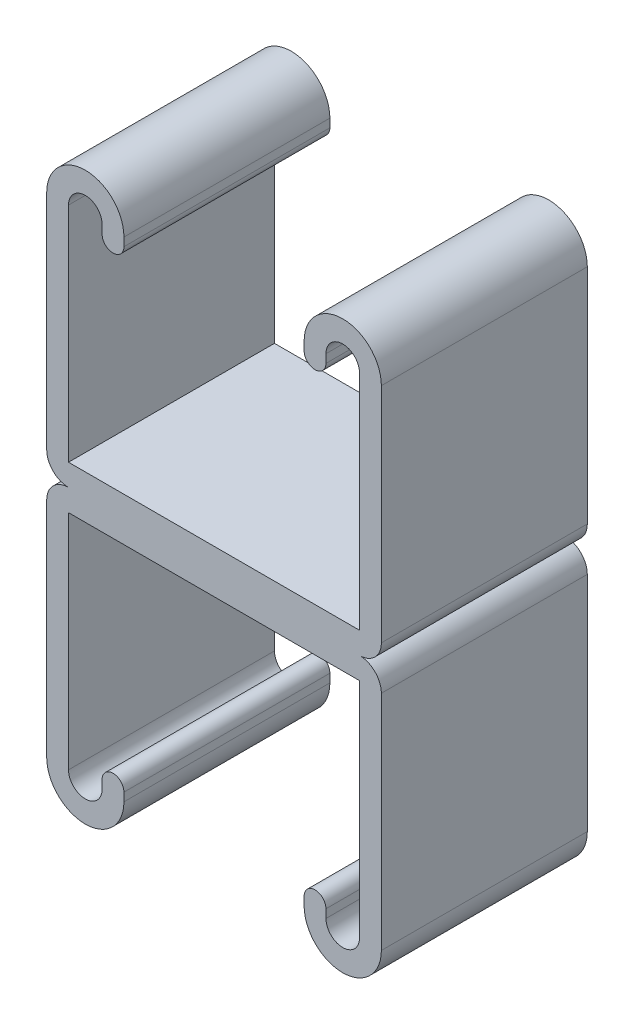
ISO-10303-21;
HEADER;
FILE_DESCRIPTION(('STEP AP214'),'2;1');
FILE_NAME('part.step','',(''),(''),'','','');
FILE_SCHEMA(('AUTOMOTIVE_DESIGN { 1 0 10303 214 1 1 1 1 }'));
ENDSEC;
DATA;
#1=APPLICATION_CONTEXT('core data for automotive mechanical design processes');
#2=APPLICATION_PROTOCOL_DEFINITION('international standard','automotive_design',2000,#1);
#3=PRODUCT_CONTEXT('',#1,'mechanical');
#4=PRODUCT('Part','Part','',(#3));
#5=PRODUCT_RELATED_PRODUCT_CATEGORY('part','',(#4));
#6=PRODUCT_DEFINITION_FORMATION('','',#4);
#7=PRODUCT_DEFINITION_CONTEXT('part definition',#1,'design');
#8=PRODUCT_DEFINITION('design','',#6,#7);
#9=PRODUCT_DEFINITION_SHAPE('','',#8);
#10=(LENGTH_UNIT() NAMED_UNIT(*) SI_UNIT(.MILLI.,.METRE.));
#11=(NAMED_UNIT(*) PLANE_ANGLE_UNIT() SI_UNIT($,.RADIAN.));
#12=(NAMED_UNIT(*) SI_UNIT($,.STERADIAN.) SOLID_ANGLE_UNIT());
#13=UNCERTAINTY_MEASURE_WITH_UNIT(LENGTH_MEASURE(1.E-05),#10,'distance_accuracy_value','');
#14=(GEOMETRIC_REPRESENTATION_CONTEXT(3) GLOBAL_UNCERTAINTY_ASSIGNED_CONTEXT((#13)) GLOBAL_UNIT_ASSIGNED_CONTEXT((#10,
#11,#12)) REPRESENTATION_CONTEXT('',''));
#15=CARTESIAN_POINT('',(0.,0.,0.));
#16=DIRECTION('',(0.,0.,1.));
#17=DIRECTION('',(1.,0.,0.));
#18=AXIS2_PLACEMENT_3D('',#15,#16,#17);
#19=CARTESIAN_POINT('',(-15.875,30.1625,12.7));
#20=DIRECTION('',(0.,0.,-1.));
#21=DIRECTION('',(-1.,0.,0.));
#22=AXIS2_PLACEMENT_3D('',#19,#20,#21);
#23=CYLINDRICAL_SURFACE('',#22,4.7625);
#24=CARTESIAN_POINT('',(-15.875,30.1625,-12.7));
#25=DIRECTION('',(0.,0.,1.));
#26=DIRECTION('',(-1.,0.,0.));
#27=AXIS2_PLACEMENT_3D('',#24,#25,#26);
#28=CIRCLE('',#27,4.7625);
#29=CARTESIAN_POINT('',(-11.1125,30.1625,-12.7));
#30=VERTEX_POINT('',#29);
#31=CARTESIAN_POINT('',(-20.6375,30.1625,-12.7));
#32=VERTEX_POINT('',#31);
#33=EDGE_CURVE('E189',#30,#32,#28,.T.);
#34=ORIENTED_EDGE('',*,*,#33,.T.);
#35=DIRECTION('',(0.,0.,-1.));
#36=VECTOR('',#35,1.);
#37=CARTESIAN_POINT('',(-20.6375,30.1625,12.7));
#38=LINE('',#37,#36);
#39=CARTESIAN_POINT('',(-20.6375,30.1625,12.7));
#40=VERTEX_POINT('',#39);
#41=EDGE_CURVE('E11',#40,#32,#38,.T.);
#42=ORIENTED_EDGE('',*,*,#41,.F.);
#43=CARTESIAN_POINT('',(-15.875,30.1625,12.7));
#44=DIRECTION('',(0.,0.,1.));
#45=DIRECTION('',(-1.,0.,0.));
#46=AXIS2_PLACEMENT_3D('',#43,#44,#45);
#47=CIRCLE('',#46,4.7625);
#48=CARTESIAN_POINT('',(-11.1125,30.1625,12.7));
#49=VERTEX_POINT('',#48);
#50=EDGE_CURVE('E222',#49,#40,#47,.T.);
#51=ORIENTED_EDGE('',*,*,#50,.F.);
#52=DIRECTION('',(0.,0.,-1.));
#53=VECTOR('',#52,1.);
#54=CARTESIAN_POINT('',(-11.1125,30.1625,12.7));
#55=LINE('',#54,#53);
#56=EDGE_CURVE('E185',#49,#30,#55,.T.);
#57=ORIENTED_EDGE('',*,*,#56,.T.);
#58=EDGE_LOOP('',(#34,#42,#51,#57));
#59=FACE_BOUND('',#58,.T.);
#60=ADVANCED_FACE('F32',(#59),#23,.T.);
#61=CARTESIAN_POINT('',(-20.6375,30.1625,12.7));
#62=DIRECTION('',(1.,0.,0.));
#63=DIRECTION('',(0.,1.,0.));
#64=AXIS2_PLACEMENT_3D('',#61,#62,#63);
#65=PLANE('',#64);
#66=DIRECTION('',(0.,-1.,0.));
#67=VECTOR('',#66,1.);
#68=CARTESIAN_POINT('',(-20.6375,30.1625,-12.7));
#69=LINE('',#68,#67);
#70=CARTESIAN_POINT('',(-20.6375,2.6924,-12.7));
#71=VERTEX_POINT('',#70);
#72=EDGE_CURVE('E192',#32,#71,#69,.T.);
#73=ORIENTED_EDGE('',*,*,#72,.T.);
#74=DIRECTION('',(0.,0.,-1.));
#75=VECTOR('',#74,1.);
#76=CARTESIAN_POINT('',(-20.6375,2.6924,12.7));
#77=LINE('',#76,#75);
#78=CARTESIAN_POINT('',(-20.6375,2.6924,12.7));
#79=VERTEX_POINT('',#78);
#80=EDGE_CURVE('E40',#79,#71,#77,.T.);
#81=ORIENTED_EDGE('',*,*,#80,.F.);
#82=DIRECTION('',(0.,-1.,0.));
#83=VECTOR('',#82,1.);
#84=CARTESIAN_POINT('',(-20.6375,30.1625,12.7));
#85=LINE('',#84,#83);
#86=EDGE_CURVE('E119',#40,#79,#85,.T.);
#87=ORIENTED_EDGE('',*,*,#86,.F.);
#88=ORIENTED_EDGE('',*,*,#41,.T.);
#89=EDGE_LOOP('',(#73,#81,#87,#88));
#90=FACE_BOUND('',#89,.T.);
#91=ADVANCED_FACE('F384',(#90),#65,.F.);
#92=CARTESIAN_POINT('',(-17.9451,2.6924,12.7));
#93=DIRECTION('',(0.,0.,-1.));
#94=DIRECTION('',(-1.,0.,0.));
#95=AXIS2_PLACEMENT_3D('',#92,#93,#94);
#96=CYLINDRICAL_SURFACE('',#95,2.6924);
#97=CARTESIAN_POINT('',(-17.9451,2.6924,-12.7));
#98=DIRECTION('',(0.,0.,1.));
#99=DIRECTION('',(-1.,0.,0.));
#100=AXIS2_PLACEMENT_3D('',#97,#98,#99);
#101=CIRCLE('',#100,2.6924);
#102=CARTESIAN_POINT('',(-17.9451,0.,-12.7));
#103=VERTEX_POINT('',#102);
#104=EDGE_CURVE('E195',#71,#103,#101,.T.);
#105=ORIENTED_EDGE('',*,*,#104,.T.);
#106=DIRECTION('',(0.,0.,-1.));
#107=VECTOR('',#106,1.);
#108=CARTESIAN_POINT('',(-17.9451,0.,12.7));
#109=LINE('',#108,#107);
#110=CARTESIAN_POINT('',(-17.9451,0.,12.7));
#111=VERTEX_POINT('',#110);
#112=EDGE_CURVE('E259',#111,#103,#109,.T.);
#113=ORIENTED_EDGE('',*,*,#112,.F.);
#114=CARTESIAN_POINT('',(-17.9451,2.6924,12.7));
#115=DIRECTION('',(0.,0.,1.));
#116=DIRECTION('',(-1.,0.,0.));
#117=AXIS2_PLACEMENT_3D('',#114,#115,#116);
#118=CIRCLE('',#117,2.6924);
#119=EDGE_CURVE('E267',#79,#111,#118,.T.);
#120=ORIENTED_EDGE('',*,*,#119,.F.);
#121=ORIENTED_EDGE('',*,*,#80,.T.);
#122=EDGE_LOOP('',(#105,#113,#120,#121));
#123=FACE_BOUND('',#122,.T.);
#124=ADVANCED_FACE('F265',(#123),#96,.T.);
#125=CARTESIAN_POINT('',(17.9451,2.69240000000001,12.7));
#126=DIRECTION('',(0.,0.,-1.));
#127=DIRECTION('',(-1.,0.,0.));
#128=AXIS2_PLACEMENT_3D('',#125,#126,#127);
#129=CYLINDRICAL_SURFACE('',#128,2.6924);
#130=CARTESIAN_POINT('',(17.9451,2.69240000000001,-12.7));
#131=DIRECTION('',(0.,0.,1.));
#132=DIRECTION('',(1.,0.,0.));
#133=AXIS2_PLACEMENT_3D('',#130,#131,#132);
#134=CIRCLE('',#133,2.6924);
#135=CARTESIAN_POINT('',(17.9451,0.,-12.7));
#136=VERTEX_POINT('',#135);
#137=CARTESIAN_POINT('',(20.6375,2.69240000000001,-12.7));
#138=VERTEX_POINT('',#137);
#139=EDGE_CURVE('E197',#136,#138,#134,.T.);
#140=ORIENTED_EDGE('',*,*,#139,.T.);
#141=DIRECTION('',(0.,0.,-1.));
#142=VECTOR('',#141,1.);
#143=CARTESIAN_POINT('',(20.6375,2.69240000000001,12.7));
#144=LINE('',#143,#142);
#145=CARTESIAN_POINT('',(20.6375,2.69240000000001,12.7));
#146=VERTEX_POINT('',#145);
#147=EDGE_CURVE('E253',#146,#138,#144,.T.);
#148=ORIENTED_EDGE('',*,*,#147,.F.);
#149=CARTESIAN_POINT('',(17.9451,2.69240000000001,12.7));
#150=DIRECTION('',(0.,0.,1.));
#151=DIRECTION('',(1.,0.,0.));
#152=AXIS2_PLACEMENT_3D('',#149,#150,#151);
#153=CIRCLE('',#152,2.6924);
#154=CARTESIAN_POINT('',(17.9451,0.,12.7));
#155=VERTEX_POINT('',#154);
#156=EDGE_CURVE('E341',#155,#146,#153,.T.);
#157=ORIENTED_EDGE('',*,*,#156,.F.);
#158=DIRECTION('',(0.,0.,-1.));
#159=VECTOR('',#158,1.);
#160=CARTESIAN_POINT('',(17.9451,0.,12.7));
#161=LINE('',#160,#159);
#162=EDGE_CURVE('E256',#155,#136,#161,.T.);
#163=ORIENTED_EDGE('',*,*,#162,.T.);
#164=EDGE_LOOP('',(#140,#148,#157,#163));
#165=FACE_BOUND('',#164,.T.);
#166=ADVANCED_FACE('F391',(#165),#129,.T.);
#167=CARTESIAN_POINT('',(20.6375,2.69240000000001,12.7));
#168=DIRECTION('',(-1.,0.,0.));
#169=DIRECTION('',(0.,-1.,0.));
#170=AXIS2_PLACEMENT_3D('',#167,#168,#169);
#171=PLANE('',#170);
#172=DIRECTION('',(0.,1.,0.));
#173=VECTOR('',#172,1.);
#174=CARTESIAN_POINT('',(20.6375,2.69240000000001,-12.7));
#175=LINE('',#174,#173);
#176=CARTESIAN_POINT('',(20.6375,30.1625,-12.7));
#177=VERTEX_POINT('',#176);
#178=EDGE_CURVE('E199',#138,#177,#175,.T.);
#179=ORIENTED_EDGE('',*,*,#178,.T.);
#180=DIRECTION('',(0.,0.,-1.));
#181=VECTOR('',#180,1.);
#182=CARTESIAN_POINT('',(20.6375,30.1625,12.7));
#183=LINE('',#182,#181);
#184=CARTESIAN_POINT('',(20.6375,30.1625,12.7));
#185=VERTEX_POINT('',#184);
#186=EDGE_CURVE('E250',#185,#177,#183,.T.);
#187=ORIENTED_EDGE('',*,*,#186,.F.);
#188=DIRECTION('',(0.,1.,0.));
#189=VECTOR('',#188,1.);
#190=CARTESIAN_POINT('',(20.6375,2.69240000000001,12.7));
#191=LINE('',#190,#189);
#192=EDGE_CURVE('E343',#146,#185,#191,.T.);
#193=ORIENTED_EDGE('',*,*,#192,.F.);
#194=ORIENTED_EDGE('',*,*,#147,.T.);
#195=EDGE_LOOP('',(#179,#187,#193,#194));
#196=FACE_BOUND('',#195,.T.);
#197=ADVANCED_FACE('F396',(#196),#171,.F.);
#198=CARTESIAN_POINT('',(15.875,30.1625,12.7));
#199=DIRECTION('',(0.,0.,-1.));
#200=DIRECTION('',(-1.,0.,0.));
#201=AXIS2_PLACEMENT_3D('',#198,#199,#200);
#202=CYLINDRICAL_SURFACE('',#201,4.7625);
#203=CARTESIAN_POINT('',(15.875,30.1625,-12.7));
#204=DIRECTION('',(0.,0.,1.));
#205=DIRECTION('',(1.,0.,0.));
#206=AXIS2_PLACEMENT_3D('',#203,#204,#205);
#207=CIRCLE('',#206,4.7625);
#208=CARTESIAN_POINT('',(11.1125,30.1625,-12.7));
#209=VERTEX_POINT('',#208);
#210=EDGE_CURVE('E201',#177,#209,#207,.T.);
#211=ORIENTED_EDGE('',*,*,#210,.T.);
#212=DIRECTION('',(0.,0.,-1.));
#213=VECTOR('',#212,1.);
#214=CARTESIAN_POINT('',(11.1125,30.1625,12.7));
#215=LINE('',#214,#213);
#216=CARTESIAN_POINT('',(11.1125,30.1625,12.7));
#217=VERTEX_POINT('',#216);
#218=EDGE_CURVE('E247',#217,#209,#215,.T.);
#219=ORIENTED_EDGE('',*,*,#218,.F.);
#220=CARTESIAN_POINT('',(15.875,30.1625,12.7));
#221=DIRECTION('',(0.,0.,1.));
#222=DIRECTION('',(1.,0.,0.));
#223=AXIS2_PLACEMENT_3D('',#220,#221,#222);
#224=CIRCLE('',#223,4.7625);
#225=EDGE_CURVE('E345',#185,#217,#224,.T.);
#226=ORIENTED_EDGE('',*,*,#225,.F.);
#227=ORIENTED_EDGE('',*,*,#186,.T.);
#228=EDGE_LOOP('',(#211,#219,#226,#227));
#229=FACE_BOUND('',#228,.T.);
#230=ADVANCED_FACE('F400',(#229),#202,.T.);
#231=CARTESIAN_POINT('',(11.1125,30.1625,12.7));
#232=DIRECTION('',(1.,0.,0.));
#233=DIRECTION('',(0.,1.,0.));
#234=AXIS2_PLACEMENT_3D('',#231,#232,#233);
#235=PLANE('',#234);
#236=DIRECTION('',(0.,-1.,0.));
#237=VECTOR('',#236,1.);
#238=CARTESIAN_POINT('',(11.1125,30.1625,-12.7));
#239=LINE('',#238,#237);
#240=CARTESIAN_POINT('',(11.1125,29.12745,-12.7));
#241=VERTEX_POINT('',#240);
#242=EDGE_CURVE('E203',#209,#241,#239,.T.);
#243=ORIENTED_EDGE('',*,*,#242,.T.);
#244=DIRECTION('',(0.,0.,-1.));
#245=VECTOR('',#244,1.);
#246=CARTESIAN_POINT('',(11.1125,29.12745,12.7));
#247=LINE('',#246,#245);
#248=CARTESIAN_POINT('',(11.1125,29.12745,12.7));
#249=VERTEX_POINT('',#248);
#250=EDGE_CURVE('E244',#249,#241,#247,.T.);
#251=ORIENTED_EDGE('',*,*,#250,.F.);
#252=DIRECTION('',(0.,-1.,0.));
#253=VECTOR('',#252,1.);
#254=CARTESIAN_POINT('',(11.1125,30.1625,12.7));
#255=LINE('',#254,#253);
#256=EDGE_CURVE('E347',#217,#249,#255,.T.);
#257=ORIENTED_EDGE('',*,*,#256,.F.);
#258=ORIENTED_EDGE('',*,*,#218,.T.);
#259=EDGE_LOOP('',(#243,#251,#257,#258));
#260=FACE_BOUND('',#259,.T.);
#261=ADVANCED_FACE('F404',(#260),#235,.F.);
#262=CARTESIAN_POINT('',(12.4587,29.12745,12.7));
#263=DIRECTION('',(0.,0.,-1.));
#264=DIRECTION('',(-1.,0.,0.));
#265=AXIS2_PLACEMENT_3D('',#262,#263,#264);
#266=CYLINDRICAL_SURFACE('',#265,1.3462);
#267=CARTESIAN_POINT('',(12.4587,29.12745,-12.7));
#268=DIRECTION('',(0.,0.,1.));
#269=DIRECTION('',(1.,0.,0.));
#270=AXIS2_PLACEMENT_3D('',#267,#268,#269);
#271=CIRCLE('',#270,1.3462);
#272=CARTESIAN_POINT('',(13.8049,29.12745,-12.7));
#273=VERTEX_POINT('',#272);
#274=EDGE_CURVE('E205',#241,#273,#271,.T.);
#275=ORIENTED_EDGE('',*,*,#274,.T.);
#276=DIRECTION('',(0.,0.,-1.));
#277=VECTOR('',#276,1.);
#278=CARTESIAN_POINT('',(13.8049,29.12745,12.7));
#279=LINE('',#278,#277);
#280=CARTESIAN_POINT('',(13.8049,29.12745,12.7));
#281=VERTEX_POINT('',#280);
#282=EDGE_CURVE('E241',#281,#273,#279,.T.);
#283=ORIENTED_EDGE('',*,*,#282,.F.);
#284=CARTESIAN_POINT('',(12.4587,29.12745,12.7));
#285=DIRECTION('',(0.,0.,1.));
#286=DIRECTION('',(1.,0.,0.));
#287=AXIS2_PLACEMENT_3D('',#284,#285,#286);
#288=CIRCLE('',#287,1.3462);
#289=EDGE_CURVE('E349',#249,#281,#288,.T.);
#290=ORIENTED_EDGE('',*,*,#289,.F.);
#291=ORIENTED_EDGE('',*,*,#250,.T.);
#292=EDGE_LOOP('',(#275,#283,#290,#291));
#293=FACE_BOUND('',#292,.T.);
#294=ADVANCED_FACE('F408',(#293),#266,.T.);
#295=CARTESIAN_POINT('',(13.8049,30.1625,12.7));
#296=DIRECTION('',(-1.,0.,0.));
#297=DIRECTION('',(0.,0.,1.));
#298=AXIS2_PLACEMENT_3D('',#295,#296,#297);
#299=PLANE('',#298);
#300=DIRECTION('',(0.,1.,0.));
#301=VECTOR('',#300,1.);
#302=CARTESIAN_POINT('',(13.8049,30.1625,-12.7));
#303=LINE('',#302,#301);
#304=CARTESIAN_POINT('',(13.8049,30.1625,-12.7));
#305=VERTEX_POINT('',#304);
#306=EDGE_CURVE('E207',#273,#305,#303,.T.);
#307=ORIENTED_EDGE('',*,*,#306,.T.);
#308=DIRECTION('',(0.,0.,-1.));
#309=VECTOR('',#308,1.);
#310=CARTESIAN_POINT('',(13.8049,30.1625,12.7));
#311=LINE('',#310,#309);
#312=CARTESIAN_POINT('',(13.8049,30.1625,12.7));
#313=VERTEX_POINT('',#312);
#314=EDGE_CURVE('E238',#313,#305,#311,.T.);
#315=ORIENTED_EDGE('',*,*,#314,.F.);
#316=DIRECTION('',(0.,1.,0.));
#317=VECTOR('',#316,1.);
#318=CARTESIAN_POINT('',(13.8049,30.1625,12.7));
#319=LINE('',#318,#317);
#320=EDGE_CURVE('E351',#281,#313,#319,.T.);
#321=ORIENTED_EDGE('',*,*,#320,.F.);
#322=ORIENTED_EDGE('',*,*,#282,.T.);
#323=EDGE_LOOP('',(#307,#315,#321,#322));
#324=FACE_BOUND('',#323,.T.);
#325=ADVANCED_FACE('F412',(#324),#299,.F.);
#326=CARTESIAN_POINT('',(15.875,30.1625,12.7));
#327=DIRECTION('',(0.,0.,-1.));
#328=DIRECTION('',(-1.,0.,0.));
#329=AXIS2_PLACEMENT_3D('',#326,#327,#328);
#330=CYLINDRICAL_SURFACE('',#329,2.0701);
#331=CARTESIAN_POINT('',(15.875,30.1625,-12.7));
#332=DIRECTION('',(0.,0.,-1.));
#333=DIRECTION('',(1.,0.,0.));
#334=AXIS2_PLACEMENT_3D('',#331,#332,#333);
#335=CIRCLE('',#334,2.0701);
#336=CARTESIAN_POINT('',(17.9451,30.1625,-12.7));
#337=VERTEX_POINT('',#336);
#338=EDGE_CURVE('E209',#305,#337,#335,.T.);
#339=ORIENTED_EDGE('',*,*,#338,.T.);
#340=DIRECTION('',(0.,0.,-1.));
#341=VECTOR('',#340,1.);
#342=CARTESIAN_POINT('',(17.9451,30.1625,12.7));
#343=LINE('',#342,#341);
#344=CARTESIAN_POINT('',(17.9451,30.1625,12.7));
#345=VERTEX_POINT('',#344);
#346=EDGE_CURVE('E235',#345,#337,#343,.T.);
#347=ORIENTED_EDGE('',*,*,#346,.F.);
#348=CARTESIAN_POINT('',(15.875,30.1625,12.7));
#349=DIRECTION('',(0.,0.,-1.));
#350=DIRECTION('',(1.,0.,0.));
#351=AXIS2_PLACEMENT_3D('',#348,#349,#350);
#352=CIRCLE('',#351,2.0701);
#353=EDGE_CURVE('E353',#313,#345,#352,.T.);
#354=ORIENTED_EDGE('',*,*,#353,.F.);
#355=ORIENTED_EDGE('',*,*,#314,.T.);
#356=EDGE_LOOP('',(#339,#347,#354,#355));
#357=FACE_BOUND('',#356,.T.);
#358=ADVANCED_FACE('F416',(#357),#330,.F.);
#359=CARTESIAN_POINT('',(17.9451,2.6924,12.7));
#360=DIRECTION('',(1.,0.,0.));
#361=DIRECTION('',(0.,0.,-1.));
#362=AXIS2_PLACEMENT_3D('',#359,#360,#361);
#363=PLANE('',#362);
#364=DIRECTION('',(0.,-1.,0.));
#365=VECTOR('',#364,1.);
#366=CARTESIAN_POINT('',(17.9451,2.6924,-12.7));
#367=LINE('',#366,#365);
#368=CARTESIAN_POINT('',(17.9451,2.6924,-12.7));
#369=VERTEX_POINT('',#368);
#370=EDGE_CURVE('E211',#337,#369,#367,.T.);
#371=ORIENTED_EDGE('',*,*,#370,.T.);
#372=DIRECTION('',(0.,0.,-1.));
#373=VECTOR('',#372,1.);
#374=CARTESIAN_POINT('',(17.9451,2.6924,12.7));
#375=LINE('',#374,#373);
#376=CARTESIAN_POINT('',(17.9451,2.6924,12.7));
#377=VERTEX_POINT('',#376);
#378=EDGE_CURVE('E232',#377,#369,#375,.T.);
#379=ORIENTED_EDGE('',*,*,#378,.F.);
#380=DIRECTION('',(0.,-1.,0.));
#381=VECTOR('',#380,1.);
#382=CARTESIAN_POINT('',(17.9451,2.6924,12.7));
#383=LINE('',#382,#381);
#384=EDGE_CURVE('E355',#345,#377,#383,.T.);
#385=ORIENTED_EDGE('',*,*,#384,.F.);
#386=ORIENTED_EDGE('',*,*,#346,.T.);
#387=EDGE_LOOP('',(#371,#379,#385,#386));
#388=FACE_BOUND('',#387,.T.);
#389=ADVANCED_FACE('F420',(#388),#363,.F.);
#390=CARTESIAN_POINT('',(-17.9451,2.6924,12.7));
#391=DIRECTION('',(0.,-1.,0.));
#392=DIRECTION('',(0.,0.,-1.));
#393=AXIS2_PLACEMENT_3D('',#390,#391,#392);
#394=PLANE('',#393);
#395=DIRECTION('',(-1.,0.,0.));
#396=VECTOR('',#395,1.);
#397=CARTESIAN_POINT('',(-17.9451,2.6924,-12.7));
#398=LINE('',#397,#396);
#399=CARTESIAN_POINT('',(-17.9451,2.6924,-12.7));
#400=VERTEX_POINT('',#399);
#401=EDGE_CURVE('E213',#369,#400,#398,.T.);
#402=ORIENTED_EDGE('',*,*,#401,.T.);
#403=DIRECTION('',(0.,0.,-1.));
#404=VECTOR('',#403,1.);
#405=CARTESIAN_POINT('',(-17.9451,2.6924,12.7));
#406=LINE('',#405,#404);
#407=CARTESIAN_POINT('',(-17.9451,2.6924,12.7));
#408=VERTEX_POINT('',#407);
#409=EDGE_CURVE('E229',#408,#400,#406,.T.);
#410=ORIENTED_EDGE('',*,*,#409,.F.);
#411=DIRECTION('',(-1.,0.,0.));
#412=VECTOR('',#411,1.);
#413=CARTESIAN_POINT('',(-17.9451,2.6924,12.7));
#414=LINE('',#413,#412);
#415=EDGE_CURVE('E357',#377,#408,#414,.T.);
#416=ORIENTED_EDGE('',*,*,#415,.F.);
#417=ORIENTED_EDGE('',*,*,#378,.T.);
#418=EDGE_LOOP('',(#402,#410,#416,#417));
#419=FACE_BOUND('',#418,.T.);
#420=ADVANCED_FACE('F424',(#419),#394,.F.);
#421=CARTESIAN_POINT('',(-17.9451,30.1625,12.7));
#422=DIRECTION('',(-1.,0.,0.));
#423=DIRECTION('',(0.,-1.,0.));
#424=AXIS2_PLACEMENT_3D('',#421,#422,#423);
#425=PLANE('',#424);
#426=DIRECTION('',(0.,1.,0.));
#427=VECTOR('',#426,1.);
#428=CARTESIAN_POINT('',(-17.9451,30.1625,-12.7));
#429=LINE('',#428,#427);
#430=CARTESIAN_POINT('',(-17.9451,30.1625,-12.7));
#431=VERTEX_POINT('',#430);
#432=EDGE_CURVE('E215',#400,#431,#429,.T.);
#433=ORIENTED_EDGE('',*,*,#432,.T.);
#434=DIRECTION('',(0.,0.,-1.));
#435=VECTOR('',#434,1.);
#436=CARTESIAN_POINT('',(-17.9451,30.1625,12.7));
#437=LINE('',#436,#435);
#438=CARTESIAN_POINT('',(-17.9451,30.1625,12.7));
#439=VERTEX_POINT('',#438);
#440=EDGE_CURVE('E226',#439,#431,#437,.T.);
#441=ORIENTED_EDGE('',*,*,#440,.F.);
#442=DIRECTION('',(0.,1.,0.));
#443=VECTOR('',#442,1.);
#444=CARTESIAN_POINT('',(-17.9451,30.1625,12.7));
#445=LINE('',#444,#443);
#446=EDGE_CURVE('E359',#408,#439,#445,.T.);
#447=ORIENTED_EDGE('',*,*,#446,.F.);
#448=ORIENTED_EDGE('',*,*,#409,.T.);
#449=EDGE_LOOP('',(#433,#441,#447,#448));
#450=FACE_BOUND('',#449,.T.);
#451=ADVANCED_FACE('F365',(#450),#425,.F.);
#452=CARTESIAN_POINT('',(-15.875,30.1625,12.7));
#453=DIRECTION('',(0.,0.,-1.));
#454=DIRECTION('',(-1.,0.,0.));
#455=AXIS2_PLACEMENT_3D('',#452,#453,#454);
#456=CYLINDRICAL_SURFACE('',#455,2.0701);
#457=CARTESIAN_POINT('',(-15.875,30.1625,-12.7));
#458=DIRECTION('',(0.,0.,-1.));
#459=DIRECTION('',(-1.,0.,0.));
#460=AXIS2_PLACEMENT_3D('',#457,#458,#459);
#461=CIRCLE('',#460,2.0701);
#462=CARTESIAN_POINT('',(-13.8049,30.1625,-12.7));
#463=VERTEX_POINT('',#462);
#464=EDGE_CURVE('E217',#431,#463,#461,.T.);
#465=ORIENTED_EDGE('',*,*,#464,.T.);
#466=DIRECTION('',(0.,0.,-1.));
#467=VECTOR('',#466,1.);
#468=CARTESIAN_POINT('',(-13.8049,30.1625,12.7));
#469=LINE('',#468,#467);
#470=CARTESIAN_POINT('',(-13.8049,30.1625,12.7));
#471=VERTEX_POINT('',#470);
#472=EDGE_CURVE('E180',#471,#463,#469,.T.);
#473=ORIENTED_EDGE('',*,*,#472,.F.);
#474=CARTESIAN_POINT('',(-15.875,30.1625,12.7));
#475=DIRECTION('',(0.,0.,-1.));
#476=DIRECTION('',(-1.,0.,0.));
#477=AXIS2_PLACEMENT_3D('',#474,#475,#476);
#478=CIRCLE('',#477,2.0701);
#479=EDGE_CURVE('E171',#439,#471,#478,.T.);
#480=ORIENTED_EDGE('',*,*,#479,.F.);
#481=ORIENTED_EDGE('',*,*,#440,.T.);
#482=EDGE_LOOP('',(#465,#473,#480,#481));
#483=FACE_BOUND('',#482,.T.);
#484=ADVANCED_FACE('F369',(#483),#456,.F.);
#485=CARTESIAN_POINT('',(-13.8049,30.1625,12.7));
#486=DIRECTION('',(1.,0.,0.));
#487=DIRECTION('',(0.,0.,-1.));
#488=AXIS2_PLACEMENT_3D('',#485,#486,#487);
#489=PLANE('',#488);
#490=DIRECTION('',(0.,-1.,0.));
#491=VECTOR('',#490,1.);
#492=CARTESIAN_POINT('',(-13.8049,30.1625,-12.7));
#493=LINE('',#492,#491);
#494=CARTESIAN_POINT('',(-13.8049,29.12745,-12.7));
#495=VERTEX_POINT('',#494);
#496=EDGE_CURVE('E179',#463,#495,#493,.T.);
#497=ORIENTED_EDGE('',*,*,#496,.T.);
#498=DIRECTION('',(0.,0.,-1.));
#499=VECTOR('',#498,1.);
#500=CARTESIAN_POINT('',(-13.8049,29.12745,12.7));
#501=LINE('',#500,#499);
#502=CARTESIAN_POINT('',(-13.8049,29.12745,12.7));
#503=VERTEX_POINT('',#502);
#504=EDGE_CURVE('E176',#503,#495,#501,.T.);
#505=ORIENTED_EDGE('',*,*,#504,.F.);
#506=DIRECTION('',(0.,-1.,0.));
#507=VECTOR('',#506,1.);
#508=CARTESIAN_POINT('',(-13.8049,30.1625,12.7));
#509=LINE('',#508,#507);
#510=EDGE_CURVE('E165',#471,#503,#509,.T.);
#511=ORIENTED_EDGE('',*,*,#510,.F.);
#512=ORIENTED_EDGE('',*,*,#472,.T.);
#513=EDGE_LOOP('',(#497,#505,#511,#512));
#514=FACE_BOUND('',#513,.T.);
#515=ADVANCED_FACE('F177',(#514),#489,.F.);
#516=CARTESIAN_POINT('',(-12.4587,29.12745,12.7));
#517=DIRECTION('',(0.,0.,-1.));
#518=DIRECTION('',(-1.,0.,0.));
#519=AXIS2_PLACEMENT_3D('',#516,#517,#518);
#520=CYLINDRICAL_SURFACE('',#519,1.3462);
#521=CARTESIAN_POINT('',(-12.4587,29.12745,-12.7));
#522=DIRECTION('',(0.,0.,1.));
#523=DIRECTION('',(-1.,0.,0.));
#524=AXIS2_PLACEMENT_3D('',#521,#522,#523);
#525=CIRCLE('',#524,1.3462);
#526=CARTESIAN_POINT('',(-11.1125,29.12745,-12.7));
#527=VERTEX_POINT('',#526);
#528=EDGE_CURVE('E105',#495,#527,#525,.T.);
#529=ORIENTED_EDGE('',*,*,#528,.T.);
#530=DIRECTION('',(0.,0.,-1.));
#531=VECTOR('',#530,1.);
#532=CARTESIAN_POINT('',(-11.1125,29.12745,12.7));
#533=LINE('',#532,#531);
#534=CARTESIAN_POINT('',(-11.1125,29.12745,12.7));
#535=VERTEX_POINT('',#534);
#536=EDGE_CURVE('E181',#535,#527,#533,.T.);
#537=ORIENTED_EDGE('',*,*,#536,.F.);
#538=CARTESIAN_POINT('',(-12.4587,29.12745,12.7));
#539=DIRECTION('',(0.,0.,1.));
#540=DIRECTION('',(-1.,0.,0.));
#541=AXIS2_PLACEMENT_3D('',#538,#539,#540);
#542=CIRCLE('',#541,1.3462);
#543=EDGE_CURVE('E169',#503,#535,#542,.T.);
#544=ORIENTED_EDGE('',*,*,#543,.F.);
#545=ORIENTED_EDGE('',*,*,#504,.T.);
#546=EDGE_LOOP('',(#529,#537,#544,#545));
#547=FACE_BOUND('',#546,.T.);
#548=ADVANCED_FACE('F183',(#547),#520,.T.);
#549=CARTESIAN_POINT('',(-11.1125,30.1625,12.7));
#550=DIRECTION('',(-1.,0.,0.));
#551=DIRECTION('',(0.,-1.,0.));
#552=AXIS2_PLACEMENT_3D('',#549,#550,#551);
#553=PLANE('',#552);
#554=DIRECTION('',(0.,1.,0.));
#555=VECTOR('',#554,1.);
#556=CARTESIAN_POINT('',(-11.1125,30.1625,-12.7));
#557=LINE('',#556,#555);
#558=EDGE_CURVE('E111',#527,#30,#557,.T.);
#559=ORIENTED_EDGE('',*,*,#558,.T.);
#560=ORIENTED_EDGE('',*,*,#56,.F.);
#561=DIRECTION('',(0.,1.,0.));
#562=VECTOR('',#561,1.);
#563=CARTESIAN_POINT('',(-11.1125,30.1625,12.7));
#564=LINE('',#563,#562);
#565=EDGE_CURVE('E48',#535,#49,#564,.T.);
#566=ORIENTED_EDGE('',*,*,#565,.F.);
#567=ORIENTED_EDGE('',*,*,#536,.T.);
#568=EDGE_LOOP('',(#559,#560,#566,#567));
#569=FACE_BOUND('',#568,.T.);
#570=ADVANCED_FACE('F373',(#569),#553,.F.);
#571=CARTESIAN_POINT('',(-15.875,30.1625,12.7));
#572=DIRECTION('',(0.,0.,-1.));
#573=DIRECTION('',(-1.,0.,0.));
#574=AXIS2_PLACEMENT_3D('',#571,#572,#573);
#575=PLANE('',#574);
#576=ORIENTED_EDGE('',*,*,#50,.T.);
#577=ORIENTED_EDGE('',*,*,#86,.T.);
#578=ORIENTED_EDGE('',*,*,#119,.T.);
#579=CARTESIAN_POINT('',(-17.9451,-2.6924,12.7));
#580=DIRECTION('',(0.,0.,-1.));
#581=DIRECTION('',(-1.,0.,0.));
#582=AXIS2_PLACEMENT_3D('',#579,#580,#581);
#583=CIRCLE('',#582,2.6924);
#584=CARTESIAN_POINT('',(-20.6375,-2.6924,12.7));
#585=VERTEX_POINT('',#584);
#586=EDGE_CURVE('E782',#585,#111,#583,.T.);
#587=ORIENTED_EDGE('',*,*,#586,.F.);
#588=DIRECTION('',(0.,1.,0.));
#589=VECTOR('',#588,1.);
#590=CARTESIAN_POINT('',(-20.6375,-30.1625,12.7));
#591=LINE('',#590,#589);
#592=CARTESIAN_POINT('',(-20.6375,-30.1625,12.7));
#593=VERTEX_POINT('',#592);
#594=EDGE_CURVE('E294',#593,#585,#591,.T.);
#595=ORIENTED_EDGE('',*,*,#594,.F.);
#596=CARTESIAN_POINT('',(-15.875,-30.1625,12.7));
#597=DIRECTION('',(0.,0.,-1.));
#598=DIRECTION('',(-1.,0.,0.));
#599=AXIS2_PLACEMENT_3D('',#596,#597,#598);
#600=CIRCLE('',#599,4.7625);
#601=CARTESIAN_POINT('',(-11.1125,-30.1625,12.7));
#602=VERTEX_POINT('',#601);
#603=EDGE_CURVE('E283',#602,#593,#600,.T.);
#604=ORIENTED_EDGE('',*,*,#603,.F.);
#605=DIRECTION('',(0.,-1.,0.));
#606=VECTOR('',#605,1.);
#607=CARTESIAN_POINT('',(-11.1125,-30.1625,12.7));
#608=LINE('',#607,#606);
#609=CARTESIAN_POINT('',(-11.1125,-29.12745,12.7));
#610=VERTEX_POINT('',#609);
#611=EDGE_CURVE('E731',#610,#602,#608,.T.);
#612=ORIENTED_EDGE('',*,*,#611,.F.);
#613=CARTESIAN_POINT('',(-12.4587,-29.12745,12.7));
#614=DIRECTION('',(0.,0.,-1.));
#615=DIRECTION('',(-1.,0.,0.));
#616=AXIS2_PLACEMENT_3D('',#613,#614,#615);
#617=CIRCLE('',#616,1.3462);
#618=CARTESIAN_POINT('',(-13.8049,-29.12745,12.7));
#619=VERTEX_POINT('',#618);
#620=EDGE_CURVE('E740',#619,#610,#617,.T.);
#621=ORIENTED_EDGE('',*,*,#620,.F.);
#622=DIRECTION('',(0.,1.,0.));
#623=VECTOR('',#622,1.);
#624=CARTESIAN_POINT('',(-13.8049,-30.1625,12.7));
#625=LINE('',#624,#623);
#626=CARTESIAN_POINT('',(-13.8049,-30.1625,12.7));
#627=VERTEX_POINT('',#626);
#628=EDGE_CURVE('E744',#627,#619,#625,.T.);
#629=ORIENTED_EDGE('',*,*,#628,.F.);
#630=CARTESIAN_POINT('',(-15.875,-30.1625,12.7));
#631=DIRECTION('',(0.,0.,1.));
#632=DIRECTION('',(-1.,0.,0.));
#633=AXIS2_PLACEMENT_3D('',#630,#631,#632);
#634=CIRCLE('',#633,2.0701);
#635=CARTESIAN_POINT('',(-17.9451,-30.1625,12.7));
#636=VERTEX_POINT('',#635);
#637=EDGE_CURVE('E746',#636,#627,#634,.T.);
#638=ORIENTED_EDGE('',*,*,#637,.F.);
#639=DIRECTION('',(0.,-1.,0.));
#640=VECTOR('',#639,1.);
#641=CARTESIAN_POINT('',(-17.9451,-30.1625,12.7));
#642=LINE('',#641,#640);
#643=CARTESIAN_POINT('',(-17.9451,-2.6924,12.7));
#644=VERTEX_POINT('',#643);
#645=EDGE_CURVE('E752',#644,#636,#642,.T.);
#646=ORIENTED_EDGE('',*,*,#645,.F.);
#647=DIRECTION('',(-1.,0.,0.));
#648=VECTOR('',#647,1.);
#649=CARTESIAN_POINT('',(-17.9451,-2.6924,12.7));
#650=LINE('',#649,#648);
#651=CARTESIAN_POINT('',(17.9451,-2.6924,12.7));
#652=VERTEX_POINT('',#651);
#653=EDGE_CURVE('E755',#652,#644,#650,.T.);
#654=ORIENTED_EDGE('',*,*,#653,.F.);
#655=DIRECTION('',(0.,1.,0.));
#656=VECTOR('',#655,1.);
#657=CARTESIAN_POINT('',(17.9451,-2.6924,12.7));
#658=LINE('',#657,#656);
#659=CARTESIAN_POINT('',(17.9451,-30.1625,12.7));
#660=VERTEX_POINT('',#659);
#661=EDGE_CURVE('E758',#660,#652,#658,.T.);
#662=ORIENTED_EDGE('',*,*,#661,.F.);
#663=CARTESIAN_POINT('',(15.875,-30.1625,12.7));
#664=DIRECTION('',(0.,0.,1.));
#665=DIRECTION('',(1.,0.,0.));
#666=AXIS2_PLACEMENT_3D('',#663,#664,#665);
#667=CIRCLE('',#666,2.0701);
#668=CARTESIAN_POINT('',(13.8049,-30.1625,12.7));
#669=VERTEX_POINT('',#668);
#670=EDGE_CURVE('E761',#669,#660,#667,.T.);
#671=ORIENTED_EDGE('',*,*,#670,.F.);
#672=DIRECTION('',(0.,-1.,0.));
#673=VECTOR('',#672,1.);
#674=CARTESIAN_POINT('',(13.8049,-30.1625,12.7));
#675=LINE('',#674,#673);
#676=CARTESIAN_POINT('',(13.8049,-29.12745,12.7));
#677=VERTEX_POINT('',#676);
#678=EDGE_CURVE('E764',#677,#669,#675,.T.);
#679=ORIENTED_EDGE('',*,*,#678,.F.);
#680=CARTESIAN_POINT('',(12.4587,-29.12745,12.7));
#681=DIRECTION('',(0.,0.,-1.));
#682=DIRECTION('',(1.,0.,0.));
#683=AXIS2_PLACEMENT_3D('',#680,#681,#682);
#684=CIRCLE('',#683,1.3462);
#685=CARTESIAN_POINT('',(11.1125,-29.12745,12.7));
#686=VERTEX_POINT('',#685);
#687=EDGE_CURVE('E767',#686,#677,#684,.T.);
#688=ORIENTED_EDGE('',*,*,#687,.F.);
#689=DIRECTION('',(0.,1.,0.));
#690=VECTOR('',#689,1.);
#691=CARTESIAN_POINT('',(11.1125,-30.1625,12.7));
#692=LINE('',#691,#690);
#693=CARTESIAN_POINT('',(11.1125,-30.1625,12.7));
#694=VERTEX_POINT('',#693);
#695=EDGE_CURVE('E770',#694,#686,#692,.T.);
#696=ORIENTED_EDGE('',*,*,#695,.F.);
#697=CARTESIAN_POINT('',(15.875,-30.1625,12.7));
#698=DIRECTION('',(0.,0.,-1.));
#699=DIRECTION('',(1.,0.,0.));
#700=AXIS2_PLACEMENT_3D('',#697,#698,#699);
#701=CIRCLE('',#700,4.7625);
#702=CARTESIAN_POINT('',(20.6375,-30.1625,12.7));
#703=VERTEX_POINT('',#702);
#704=EDGE_CURVE('E773',#703,#694,#701,.T.);
#705=ORIENTED_EDGE('',*,*,#704,.F.);
#706=DIRECTION('',(0.,-1.,0.));
#707=VECTOR('',#706,1.);
#708=CARTESIAN_POINT('',(20.6375,-2.69240000000001,12.7));
#709=LINE('',#708,#707);
#710=CARTESIAN_POINT('',(20.6375,-2.69240000000001,12.7));
#711=VERTEX_POINT('',#710);
#712=EDGE_CURVE('E776',#711,#703,#709,.T.);
#713=ORIENTED_EDGE('',*,*,#712,.F.);
#714=CARTESIAN_POINT('',(17.9451,-2.69240000000001,12.7));
#715=DIRECTION('',(0.,0.,-1.));
#716=DIRECTION('',(1.,0.,0.));
#717=AXIS2_PLACEMENT_3D('',#714,#715,#716);
#718=CIRCLE('',#717,2.6924);
#719=EDGE_CURVE('E779',#155,#711,#718,.T.);
#720=ORIENTED_EDGE('',*,*,#719,.F.);
#721=ORIENTED_EDGE('',*,*,#156,.T.);
#722=ORIENTED_EDGE('',*,*,#192,.T.);
#723=ORIENTED_EDGE('',*,*,#225,.T.);
#724=ORIENTED_EDGE('',*,*,#256,.T.);
#725=ORIENTED_EDGE('',*,*,#289,.T.);
#726=ORIENTED_EDGE('',*,*,#320,.T.);
#727=ORIENTED_EDGE('',*,*,#353,.T.);
#728=ORIENTED_EDGE('',*,*,#384,.T.);
#729=ORIENTED_EDGE('',*,*,#415,.T.);
#730=ORIENTED_EDGE('',*,*,#446,.T.);
#731=ORIENTED_EDGE('',*,*,#479,.T.);
#732=ORIENTED_EDGE('',*,*,#510,.T.);
#733=ORIENTED_EDGE('',*,*,#543,.T.);
#734=ORIENTED_EDGE('',*,*,#565,.T.);
#735=EDGE_LOOP('',(#576,#577,#578,#587,#595,#604,#612,#621,#629,#638,#646,#654,#662,#671,#679,
#688,#696,#705,#713,#720,#721,#722,#723,#724,#725,#726,#727,#728,#729,#730,#731,#732,#733,#734));
#736=FACE_BOUND('',#735,.T.);
#737=ADVANCED_FACE('F167',(#736),#575,.F.);
#738=CARTESIAN_POINT('',(-15.875,30.1625,-12.7));
#739=DIRECTION('',(0.,0.,-1.));
#740=DIRECTION('',(-1.,0.,0.));
#741=AXIS2_PLACEMENT_3D('',#738,#739,#740);
#742=PLANE('',#741);
#743=ORIENTED_EDGE('',*,*,#33,.F.);
#744=ORIENTED_EDGE('',*,*,#558,.F.);
#745=ORIENTED_EDGE('',*,*,#528,.F.);
#746=ORIENTED_EDGE('',*,*,#496,.F.);
#747=ORIENTED_EDGE('',*,*,#464,.F.);
#748=ORIENTED_EDGE('',*,*,#432,.F.);
#749=ORIENTED_EDGE('',*,*,#401,.F.);
#750=ORIENTED_EDGE('',*,*,#370,.F.);
#751=ORIENTED_EDGE('',*,*,#338,.F.);
#752=ORIENTED_EDGE('',*,*,#306,.F.);
#753=ORIENTED_EDGE('',*,*,#274,.F.);
#754=ORIENTED_EDGE('',*,*,#242,.F.);
#755=ORIENTED_EDGE('',*,*,#210,.F.);
#756=ORIENTED_EDGE('',*,*,#178,.F.);
#757=ORIENTED_EDGE('',*,*,#139,.F.);
#758=CARTESIAN_POINT('',(17.9451,-2.69240000000001,-12.7));
#759=DIRECTION('',(0.,0.,-1.));
#760=DIRECTION('',(1.,0.,0.));
#761=AXIS2_PLACEMENT_3D('',#758,#759,#760);
#762=CIRCLE('',#761,2.6924);
#763=CARTESIAN_POINT('',(20.6375,-2.69240000000001,-12.7));
#764=VERTEX_POINT('',#763);
#765=EDGE_CURVE('E281',#136,#764,#762,.T.);
#766=ORIENTED_EDGE('',*,*,#765,.T.);
#767=DIRECTION('',(0.,-1.,0.));
#768=VECTOR('',#767,1.);
#769=CARTESIAN_POINT('',(20.6375,-2.69240000000001,-12.7));
#770=LINE('',#769,#768);
#771=CARTESIAN_POINT('',(20.6375,-30.1625,-12.7));
#772=VERTEX_POINT('',#771);
#773=EDGE_CURVE('E286',#764,#772,#770,.T.);
#774=ORIENTED_EDGE('',*,*,#773,.T.);
#775=CARTESIAN_POINT('',(15.875,-30.1625,-12.7));
#776=DIRECTION('',(0.,0.,-1.));
#777=DIRECTION('',(1.,0.,0.));
#778=AXIS2_PLACEMENT_3D('',#775,#776,#777);
#779=CIRCLE('',#778,4.7625);
#780=CARTESIAN_POINT('',(11.1125,-30.1625,-12.7));
#781=VERTEX_POINT('',#780);
#782=EDGE_CURVE('E818',#772,#781,#779,.T.);
#783=ORIENTED_EDGE('',*,*,#782,.T.);
#784=DIRECTION('',(0.,1.,0.));
#785=VECTOR('',#784,1.);
#786=CARTESIAN_POINT('',(11.1125,-30.1625,-12.7));
#787=LINE('',#786,#785);
#788=CARTESIAN_POINT('',(11.1125,-29.12745,-12.7));
#789=VERTEX_POINT('',#788);
#790=EDGE_CURVE('E815',#781,#789,#787,.T.);
#791=ORIENTED_EDGE('',*,*,#790,.T.);
#792=CARTESIAN_POINT('',(12.4587,-29.12745,-12.7));
#793=DIRECTION('',(0.,0.,-1.));
#794=DIRECTION('',(1.,0.,0.));
#795=AXIS2_PLACEMENT_3D('',#792,#793,#794);
#796=CIRCLE('',#795,1.3462);
#797=CARTESIAN_POINT('',(13.8049,-29.12745,-12.7));
#798=VERTEX_POINT('',#797);
#799=EDGE_CURVE('E812',#789,#798,#796,.T.);
#800=ORIENTED_EDGE('',*,*,#799,.T.);
#801=DIRECTION('',(0.,-1.,0.));
#802=VECTOR('',#801,1.);
#803=CARTESIAN_POINT('',(13.8049,-30.1625,-12.7));
#804=LINE('',#803,#802);
#805=CARTESIAN_POINT('',(13.8049,-30.1625,-12.7));
#806=VERTEX_POINT('',#805);
#807=EDGE_CURVE('E809',#798,#806,#804,.T.);
#808=ORIENTED_EDGE('',*,*,#807,.T.);
#809=CARTESIAN_POINT('',(15.875,-30.1625,-12.7));
#810=DIRECTION('',(0.,0.,1.));
#811=DIRECTION('',(1.,0.,0.));
#812=AXIS2_PLACEMENT_3D('',#809,#810,#811);
#813=CIRCLE('',#812,2.0701);
#814=CARTESIAN_POINT('',(17.9451,-30.1625,-12.7));
#815=VERTEX_POINT('',#814);
#816=EDGE_CURVE('E806',#806,#815,#813,.T.);
#817=ORIENTED_EDGE('',*,*,#816,.T.);
#818=DIRECTION('',(0.,1.,0.));
#819=VECTOR('',#818,1.);
#820=CARTESIAN_POINT('',(17.9451,-2.6924,-12.7));
#821=LINE('',#820,#819);
#822=CARTESIAN_POINT('',(17.9451,-2.6924,-12.7));
#823=VERTEX_POINT('',#822);
#824=EDGE_CURVE('E803',#815,#823,#821,.T.);
#825=ORIENTED_EDGE('',*,*,#824,.T.);
#826=DIRECTION('',(-1.,0.,0.));
#827=VECTOR('',#826,1.);
#828=CARTESIAN_POINT('',(-17.9451,-2.6924,-12.7));
#829=LINE('',#828,#827);
#830=CARTESIAN_POINT('',(-17.9451,-2.6924,-12.7));
#831=VERTEX_POINT('',#830);
#832=EDGE_CURVE('E800',#823,#831,#829,.T.);
#833=ORIENTED_EDGE('',*,*,#832,.T.);
#834=DIRECTION('',(0.,-1.,0.));
#835=VECTOR('',#834,1.);
#836=CARTESIAN_POINT('',(-17.9451,-30.1625,-12.7));
#837=LINE('',#836,#835);
#838=CARTESIAN_POINT('',(-17.9451,-30.1625,-12.7));
#839=VERTEX_POINT('',#838);
#840=EDGE_CURVE('E797',#831,#839,#837,.T.);
#841=ORIENTED_EDGE('',*,*,#840,.T.);
#842=CARTESIAN_POINT('',(-15.875,-30.1625,-12.7));
#843=DIRECTION('',(0.,0.,1.));
#844=DIRECTION('',(-1.,0.,0.));
#845=AXIS2_PLACEMENT_3D('',#842,#843,#844);
#846=CIRCLE('',#845,2.0701);
#847=CARTESIAN_POINT('',(-13.8049,-30.1625,-12.7));
#848=VERTEX_POINT('',#847);
#849=EDGE_CURVE('E794',#839,#848,#846,.T.);
#850=ORIENTED_EDGE('',*,*,#849,.T.);
#851=DIRECTION('',(0.,1.,0.));
#852=VECTOR('',#851,1.);
#853=CARTESIAN_POINT('',(-13.8049,-30.1625,-12.7));
#854=LINE('',#853,#852);
#855=CARTESIAN_POINT('',(-13.8049,-29.12745,-12.7));
#856=VERTEX_POINT('',#855);
#857=EDGE_CURVE('E791',#848,#856,#854,.T.);
#858=ORIENTED_EDGE('',*,*,#857,.T.);
#859=CARTESIAN_POINT('',(-12.4587,-29.12745,-12.7));
#860=DIRECTION('',(0.,0.,-1.));
#861=DIRECTION('',(-1.,0.,0.));
#862=AXIS2_PLACEMENT_3D('',#859,#860,#861);
#863=CIRCLE('',#862,1.3462);
#864=CARTESIAN_POINT('',(-11.1125,-29.12745,-12.7));
#865=VERTEX_POINT('',#864);
#866=EDGE_CURVE('E789',#856,#865,#863,.T.);
#867=ORIENTED_EDGE('',*,*,#866,.T.);
#868=DIRECTION('',(0.,-1.,0.));
#869=VECTOR('',#868,1.);
#870=CARTESIAN_POINT('',(-11.1125,-30.1625,-12.7));
#871=LINE('',#870,#869);
#872=CARTESIAN_POINT('',(-11.1125,-30.1625,-12.7));
#873=VERTEX_POINT('',#872);
#874=EDGE_CURVE('E733',#865,#873,#871,.T.);
#875=ORIENTED_EDGE('',*,*,#874,.T.);
#876=CARTESIAN_POINT('',(-15.875,-30.1625,-12.7));
#877=DIRECTION('',(0.,0.,-1.));
#878=DIRECTION('',(-1.,0.,0.));
#879=AXIS2_PLACEMENT_3D('',#876,#877,#878);
#880=CIRCLE('',#879,4.7625);
#881=CARTESIAN_POINT('',(-20.6375,-30.1625,-12.7));
#882=VERTEX_POINT('',#881);
#883=EDGE_CURVE('E786',#873,#882,#880,.T.);
#884=ORIENTED_EDGE('',*,*,#883,.T.);
#885=DIRECTION('',(0.,1.,0.));
#886=VECTOR('',#885,1.);
#887=CARTESIAN_POINT('',(-20.6375,-30.1625,-12.7));
#888=LINE('',#887,#886);
#889=CARTESIAN_POINT('',(-20.6375,-2.6924,-12.7));
#890=VERTEX_POINT('',#889);
#891=EDGE_CURVE('E278',#882,#890,#888,.T.);
#892=ORIENTED_EDGE('',*,*,#891,.T.);
#893=CARTESIAN_POINT('',(-17.9451,-2.6924,-12.7));
#894=DIRECTION('',(0.,0.,-1.));
#895=DIRECTION('',(-1.,0.,0.));
#896=AXIS2_PLACEMENT_3D('',#893,#894,#895);
#897=CIRCLE('',#896,2.6924);
#898=EDGE_CURVE('E274',#890,#103,#897,.T.);
#899=ORIENTED_EDGE('',*,*,#898,.T.);
#900=ORIENTED_EDGE('',*,*,#104,.F.);
#901=ORIENTED_EDGE('',*,*,#72,.F.);
#902=EDGE_LOOP('',(#743,#744,#745,#746,#747,#748,#749,#750,#751,#752,#753,#754,#755,#756,#757,
#766,#774,#783,#791,#800,#808,#817,#825,#833,#841,#850,#858,#867,#875,#884,#892,#899,#900,#901));
#903=FACE_BOUND('',#902,.T.);
#904=ADVANCED_FACE('F271',(#903),#742,.T.);
#905=CARTESIAN_POINT('',(-15.875,-30.1625,12.7));
#906=DIRECTION('',(0.,0.,-1.));
#907=DIRECTION('',(-1.,0.,0.));
#908=AXIS2_PLACEMENT_3D('',#905,#906,#907);
#909=CYLINDRICAL_SURFACE('',#908,4.7625);
#910=ORIENTED_EDGE('',*,*,#883,.F.);
#911=DIRECTION('',(0.,0.,-1.));
#912=VECTOR('',#911,1.);
#913=CARTESIAN_POINT('',(-11.1125,-30.1625,12.7));
#914=LINE('',#913,#912);
#915=EDGE_CURVE('E193',#602,#873,#914,.T.);
#916=ORIENTED_EDGE('',*,*,#915,.F.);
#917=ORIENTED_EDGE('',*,*,#603,.T.);
#918=DIRECTION('',(0.,0.,-1.));
#919=VECTOR('',#918,1.);
#920=CARTESIAN_POINT('',(-20.6375,-30.1625,12.7));
#921=LINE('',#920,#919);
#922=EDGE_CURVE('E290',#593,#882,#921,.T.);
#923=ORIENTED_EDGE('',*,*,#922,.T.);
#924=EDGE_LOOP('',(#910,#916,#917,#923));
#925=FACE_BOUND('',#924,.T.);
#926=ADVANCED_FACE('F477',(#925),#909,.T.);
#927=CARTESIAN_POINT('',(-11.1125,-30.1625,12.7));
#928=DIRECTION('',(1.,0.,0.));
#929=DIRECTION('',(0.,1.,0.));
#930=AXIS2_PLACEMENT_3D('',#927,#928,#929);
#931=PLANE('',#930);
#932=ORIENTED_EDGE('',*,*,#874,.F.);
#933=DIRECTION('',(0.,0.,-1.));
#934=VECTOR('',#933,1.);
#935=CARTESIAN_POINT('',(-11.1125,-29.12745,12.7));
#936=LINE('',#935,#934);
#937=EDGE_CURVE('E333',#610,#865,#936,.T.);
#938=ORIENTED_EDGE('',*,*,#937,.F.);
#939=ORIENTED_EDGE('',*,*,#611,.T.);
#940=ORIENTED_EDGE('',*,*,#915,.T.);
#941=EDGE_LOOP('',(#932,#938,#939,#940));
#942=FACE_BOUND('',#941,.T.);
#943=ADVANCED_FACE('F485',(#942),#931,.T.);
#944=CARTESIAN_POINT('',(-12.4587,-29.12745,12.7));
#945=DIRECTION('',(0.,0.,-1.));
#946=DIRECTION('',(-1.,0.,0.));
#947=AXIS2_PLACEMENT_3D('',#944,#945,#946);
#948=CYLINDRICAL_SURFACE('',#947,1.3462);
#949=ORIENTED_EDGE('',*,*,#866,.F.);
#950=DIRECTION('',(0.,0.,-1.));
#951=VECTOR('',#950,1.);
#952=CARTESIAN_POINT('',(-13.8049,-29.12745,12.7));
#953=LINE('',#952,#951);
#954=EDGE_CURVE('E330',#619,#856,#953,.T.);
#955=ORIENTED_EDGE('',*,*,#954,.F.);
#956=ORIENTED_EDGE('',*,*,#620,.T.);
#957=ORIENTED_EDGE('',*,*,#937,.T.);
#958=EDGE_LOOP('',(#949,#955,#956,#957));
#959=FACE_BOUND('',#958,.T.);
#960=ADVANCED_FACE('F495',(#959),#948,.T.);
#961=CARTESIAN_POINT('',(-13.8049,-30.1625,12.7));
#962=DIRECTION('',(-1.,0.,0.));
#963=DIRECTION('',(0.,0.,1.));
#964=AXIS2_PLACEMENT_3D('',#961,#962,#963);
#965=PLANE('',#964);
#966=ORIENTED_EDGE('',*,*,#857,.F.);
#967=DIRECTION('',(0.,0.,-1.));
#968=VECTOR('',#967,1.);
#969=CARTESIAN_POINT('',(-13.8049,-30.1625,12.7));
#970=LINE('',#969,#968);
#971=EDGE_CURVE('E327',#627,#848,#970,.T.);
#972=ORIENTED_EDGE('',*,*,#971,.F.);
#973=ORIENTED_EDGE('',*,*,#628,.T.);
#974=ORIENTED_EDGE('',*,*,#954,.T.);
#975=EDGE_LOOP('',(#966,#972,#973,#974));
#976=FACE_BOUND('',#975,.T.);
#977=ADVANCED_FACE('F505',(#976),#965,.T.);
#978=CARTESIAN_POINT('',(-15.875,-30.1625,12.7));
#979=DIRECTION('',(0.,0.,-1.));
#980=DIRECTION('',(-1.,0.,0.));
#981=AXIS2_PLACEMENT_3D('',#978,#979,#980);
#982=CYLINDRICAL_SURFACE('',#981,2.0701);
#983=ORIENTED_EDGE('',*,*,#849,.F.);
#984=DIRECTION('',(0.,0.,-1.));
#985=VECTOR('',#984,1.);
#986=CARTESIAN_POINT('',(-17.9451,-30.1625,12.7));
#987=LINE('',#986,#985);
#988=EDGE_CURVE('E324',#636,#839,#987,.T.);
#989=ORIENTED_EDGE('',*,*,#988,.F.);
#990=ORIENTED_EDGE('',*,*,#637,.T.);
#991=ORIENTED_EDGE('',*,*,#971,.T.);
#992=EDGE_LOOP('',(#983,#989,#990,#991));
#993=FACE_BOUND('',#992,.T.);
#994=ADVANCED_FACE('F515',(#993),#982,.F.);
#995=CARTESIAN_POINT('',(-17.9451,-30.1625,12.7));
#996=DIRECTION('',(1.,0.,0.));
#997=DIRECTION('',(0.,1.,0.));
#998=AXIS2_PLACEMENT_3D('',#995,#996,#997);
#999=PLANE('',#998);
#1000=ORIENTED_EDGE('',*,*,#840,.F.);
#1001=DIRECTION('',(0.,0.,-1.));
#1002=VECTOR('',#1001,1.);
#1003=CARTESIAN_POINT('',(-17.9451,-2.6924,12.7));
#1004=LINE('',#1003,#1002);
#1005=EDGE_CURVE('E321',#644,#831,#1004,.T.);
#1006=ORIENTED_EDGE('',*,*,#1005,.F.);
#1007=ORIENTED_EDGE('',*,*,#645,.T.);
#1008=ORIENTED_EDGE('',*,*,#988,.T.);
#1009=EDGE_LOOP('',(#1000,#1006,#1007,#1008));
#1010=FACE_BOUND('',#1009,.T.);
#1011=ADVANCED_FACE('F525',(#1010),#999,.T.);
#1012=CARTESIAN_POINT('',(-17.9451,-2.6924,12.7));
#1013=DIRECTION('',(0.,-1.,0.));
#1014=DIRECTION('',(0.,0.,-1.));
#1015=AXIS2_PLACEMENT_3D('',#1012,#1013,#1014);
#1016=PLANE('',#1015);
#1017=ORIENTED_EDGE('',*,*,#832,.F.);
#1018=DIRECTION('',(0.,0.,-1.));
#1019=VECTOR('',#1018,1.);
#1020=CARTESIAN_POINT('',(17.9451,-2.6924,12.7));
#1021=LINE('',#1020,#1019);
#1022=EDGE_CURVE('E318',#652,#823,#1021,.T.);
#1023=ORIENTED_EDGE('',*,*,#1022,.F.);
#1024=ORIENTED_EDGE('',*,*,#653,.T.);
#1025=ORIENTED_EDGE('',*,*,#1005,.T.);
#1026=EDGE_LOOP('',(#1017,#1023,#1024,#1025));
#1027=FACE_BOUND('',#1026,.T.);
#1028=ADVANCED_FACE('F535',(#1027),#1016,.T.);
#1029=CARTESIAN_POINT('',(17.9451,-2.6924,12.7));
#1030=DIRECTION('',(-1.,0.,0.));
#1031=DIRECTION('',(0.,0.,1.));
#1032=AXIS2_PLACEMENT_3D('',#1029,#1030,#1031);
#1033=PLANE('',#1032);
#1034=ORIENTED_EDGE('',*,*,#824,.F.);
#1035=DIRECTION('',(0.,0.,-1.));
#1036=VECTOR('',#1035,1.);
#1037=CARTESIAN_POINT('',(17.9451,-30.1625,12.7));
#1038=LINE('',#1037,#1036);
#1039=EDGE_CURVE('E315',#660,#815,#1038,.T.);
#1040=ORIENTED_EDGE('',*,*,#1039,.F.);
#1041=ORIENTED_EDGE('',*,*,#661,.T.);
#1042=ORIENTED_EDGE('',*,*,#1022,.T.);
#1043=EDGE_LOOP('',(#1034,#1040,#1041,#1042));
#1044=FACE_BOUND('',#1043,.T.);
#1045=ADVANCED_FACE('F545',(#1044),#1033,.T.);
#1046=CARTESIAN_POINT('',(15.875,-30.1625,12.7));
#1047=DIRECTION('',(0.,0.,-1.));
#1048=DIRECTION('',(-1.,0.,0.));
#1049=AXIS2_PLACEMENT_3D('',#1046,#1047,#1048);
#1050=CYLINDRICAL_SURFACE('',#1049,2.0701);
#1051=ORIENTED_EDGE('',*,*,#816,.F.);
#1052=DIRECTION('',(0.,0.,-1.));
#1053=VECTOR('',#1052,1.);
#1054=CARTESIAN_POINT('',(13.8049,-30.1625,12.7));
#1055=LINE('',#1054,#1053);
#1056=EDGE_CURVE('E312',#669,#806,#1055,.T.);
#1057=ORIENTED_EDGE('',*,*,#1056,.F.);
#1058=ORIENTED_EDGE('',*,*,#670,.T.);
#1059=ORIENTED_EDGE('',*,*,#1039,.T.);
#1060=EDGE_LOOP('',(#1051,#1057,#1058,#1059));
#1061=FACE_BOUND('',#1060,.T.);
#1062=ADVANCED_FACE('F555',(#1061),#1050,.F.);
#1063=CARTESIAN_POINT('',(13.8049,-30.1625,12.7));
#1064=DIRECTION('',(1.,0.,0.));
#1065=DIRECTION('',(0.,0.,-1.));
#1066=AXIS2_PLACEMENT_3D('',#1063,#1064,#1065);
#1067=PLANE('',#1066);
#1068=ORIENTED_EDGE('',*,*,#807,.F.);
#1069=DIRECTION('',(0.,0.,-1.));
#1070=VECTOR('',#1069,1.);
#1071=CARTESIAN_POINT('',(13.8049,-29.12745,12.7));
#1072=LINE('',#1071,#1070);
#1073=EDGE_CURVE('E309',#677,#798,#1072,.T.);
#1074=ORIENTED_EDGE('',*,*,#1073,.F.);
#1075=ORIENTED_EDGE('',*,*,#678,.T.);
#1076=ORIENTED_EDGE('',*,*,#1056,.T.);
#1077=EDGE_LOOP('',(#1068,#1074,#1075,#1076));
#1078=FACE_BOUND('',#1077,.T.);
#1079=ADVANCED_FACE('F565',(#1078),#1067,.T.);
#1080=CARTESIAN_POINT('',(12.4587,-29.12745,12.7));
#1081=DIRECTION('',(0.,0.,-1.));
#1082=DIRECTION('',(-1.,0.,0.));
#1083=AXIS2_PLACEMENT_3D('',#1080,#1081,#1082);
#1084=CYLINDRICAL_SURFACE('',#1083,1.3462);
#1085=ORIENTED_EDGE('',*,*,#799,.F.);
#1086=DIRECTION('',(0.,0.,-1.));
#1087=VECTOR('',#1086,1.);
#1088=CARTESIAN_POINT('',(11.1125,-29.12745,12.7));
#1089=LINE('',#1088,#1087);
#1090=EDGE_CURVE('E306',#686,#789,#1089,.T.);
#1091=ORIENTED_EDGE('',*,*,#1090,.F.);
#1092=ORIENTED_EDGE('',*,*,#687,.T.);
#1093=ORIENTED_EDGE('',*,*,#1073,.T.);
#1094=EDGE_LOOP('',(#1085,#1091,#1092,#1093));
#1095=FACE_BOUND('',#1094,.T.);
#1096=ADVANCED_FACE('F575',(#1095),#1084,.T.);
#1097=CARTESIAN_POINT('',(11.1125,-30.1625,12.7));
#1098=DIRECTION('',(-1.,0.,0.));
#1099=DIRECTION('',(0.,-1.,0.));
#1100=AXIS2_PLACEMENT_3D('',#1097,#1098,#1099);
#1101=PLANE('',#1100);
#1102=ORIENTED_EDGE('',*,*,#790,.F.);
#1103=DIRECTION('',(0.,0.,-1.));
#1104=VECTOR('',#1103,1.);
#1105=CARTESIAN_POINT('',(11.1125,-30.1625,12.7));
#1106=LINE('',#1105,#1104);
#1107=EDGE_CURVE('E303',#694,#781,#1106,.T.);
#1108=ORIENTED_EDGE('',*,*,#1107,.F.);
#1109=ORIENTED_EDGE('',*,*,#695,.T.);
#1110=ORIENTED_EDGE('',*,*,#1090,.T.);
#1111=EDGE_LOOP('',(#1102,#1108,#1109,#1110));
#1112=FACE_BOUND('',#1111,.T.);
#1113=ADVANCED_FACE('F585',(#1112),#1101,.T.);
#1114=CARTESIAN_POINT('',(15.875,-30.1625,12.7));
#1115=DIRECTION('',(0.,0.,-1.));
#1116=DIRECTION('',(-1.,0.,0.));
#1117=AXIS2_PLACEMENT_3D('',#1114,#1115,#1116);
#1118=CYLINDRICAL_SURFACE('',#1117,4.7625);
#1119=ORIENTED_EDGE('',*,*,#782,.F.);
#1120=DIRECTION('',(0.,0.,-1.));
#1121=VECTOR('',#1120,1.);
#1122=CARTESIAN_POINT('',(20.6375,-30.1625,12.7));
#1123=LINE('',#1122,#1121);
#1124=EDGE_CURVE('E300',#703,#772,#1123,.T.);
#1125=ORIENTED_EDGE('',*,*,#1124,.F.);
#1126=ORIENTED_EDGE('',*,*,#704,.T.);
#1127=ORIENTED_EDGE('',*,*,#1107,.T.);
#1128=EDGE_LOOP('',(#1119,#1125,#1126,#1127));
#1129=FACE_BOUND('',#1128,.T.);
#1130=ADVANCED_FACE('F595',(#1129),#1118,.T.);
#1131=CARTESIAN_POINT('',(20.6375,-2.69240000000001,12.7));
#1132=DIRECTION('',(1.,0.,0.));
#1133=DIRECTION('',(0.,1.,0.));
#1134=AXIS2_PLACEMENT_3D('',#1131,#1132,#1133);
#1135=PLANE('',#1134);
#1136=ORIENTED_EDGE('',*,*,#773,.F.);
#1137=DIRECTION('',(0.,0.,-1.));
#1138=VECTOR('',#1137,1.);
#1139=CARTESIAN_POINT('',(20.6375,-2.69240000000001,12.7));
#1140=LINE('',#1139,#1138);
#1141=EDGE_CURVE('E297',#711,#764,#1140,.T.);
#1142=ORIENTED_EDGE('',*,*,#1141,.F.);
#1143=ORIENTED_EDGE('',*,*,#712,.T.);
#1144=ORIENTED_EDGE('',*,*,#1124,.T.);
#1145=EDGE_LOOP('',(#1136,#1142,#1143,#1144));
#1146=FACE_BOUND('',#1145,.T.);
#1147=ADVANCED_FACE('F605',(#1146),#1135,.T.);
#1148=CARTESIAN_POINT('',(17.9451,-2.69240000000001,12.7));
#1149=DIRECTION('',(0.,0.,-1.));
#1150=DIRECTION('',(-1.,0.,0.));
#1151=AXIS2_PLACEMENT_3D('',#1148,#1149,#1150);
#1152=CYLINDRICAL_SURFACE('',#1151,2.6924);
#1153=ORIENTED_EDGE('',*,*,#765,.F.);
#1154=ORIENTED_EDGE('',*,*,#162,.F.);
#1155=ORIENTED_EDGE('',*,*,#719,.T.);
#1156=ORIENTED_EDGE('',*,*,#1141,.T.);
#1157=EDGE_LOOP('',(#1153,#1154,#1155,#1156));
#1158=FACE_BOUND('',#1157,.T.);
#1159=ADVANCED_FACE('F615',(#1158),#1152,.T.);
#1160=CARTESIAN_POINT('',(-17.9451,-2.6924,12.7));
#1161=DIRECTION('',(0.,0.,-1.));
#1162=DIRECTION('',(-1.,0.,0.));
#1163=AXIS2_PLACEMENT_3D('',#1160,#1161,#1162);
#1164=CYLINDRICAL_SURFACE('',#1163,2.6924);
#1165=ORIENTED_EDGE('',*,*,#898,.F.);
#1166=DIRECTION('',(0.,0.,-1.));
#1167=VECTOR('',#1166,1.);
#1168=CARTESIAN_POINT('',(-20.6375,-2.6924,12.7));
#1169=LINE('',#1168,#1167);
#1170=EDGE_CURVE('E293',#585,#890,#1169,.T.);
#1171=ORIENTED_EDGE('',*,*,#1170,.F.);
#1172=ORIENTED_EDGE('',*,*,#586,.T.);
#1173=ORIENTED_EDGE('',*,*,#112,.T.);
#1174=EDGE_LOOP('',(#1165,#1171,#1172,#1173));
#1175=FACE_BOUND('',#1174,.T.);
#1176=ADVANCED_FACE('F625',(#1175),#1164,.T.);
#1177=CARTESIAN_POINT('',(-20.6375,-30.1625,12.7));
#1178=DIRECTION('',(-1.,0.,0.));
#1179=DIRECTION('',(0.,-1.,0.));
#1180=AXIS2_PLACEMENT_3D('',#1177,#1178,#1179);
#1181=PLANE('',#1180);
#1182=ORIENTED_EDGE('',*,*,#891,.F.);
#1183=ORIENTED_EDGE('',*,*,#922,.F.);
#1184=ORIENTED_EDGE('',*,*,#594,.T.);
#1185=ORIENTED_EDGE('',*,*,#1170,.T.);
#1186=EDGE_LOOP('',(#1182,#1183,#1184,#1185));
#1187=FACE_BOUND('',#1186,.T.);
#1188=ADVANCED_FACE('F635',(#1187),#1181,.T.);
#1189=CLOSED_SHELL('',(#60,#91,#124,#166,#197,#230,#261,#294,#325,#358,#389,#420,#451,#484,#515,
#548,#570,#737,#904,#926,#943,#960,#977,#994,#1011,#1028,#1045,#1062,#1079,#1096,#1113,#1130,
#1147,#1159,#1176,#1188));
#1190=MANIFOLD_SOLID_BREP('B2',#1189);
#1191=ADVANCED_BREP_SHAPE_REPRESENTATION('',(#18,#1190),#14);
#1192=SHAPE_DEFINITION_REPRESENTATION(#9,#1191);
ENDSEC;
END-ISO-10303-21;
